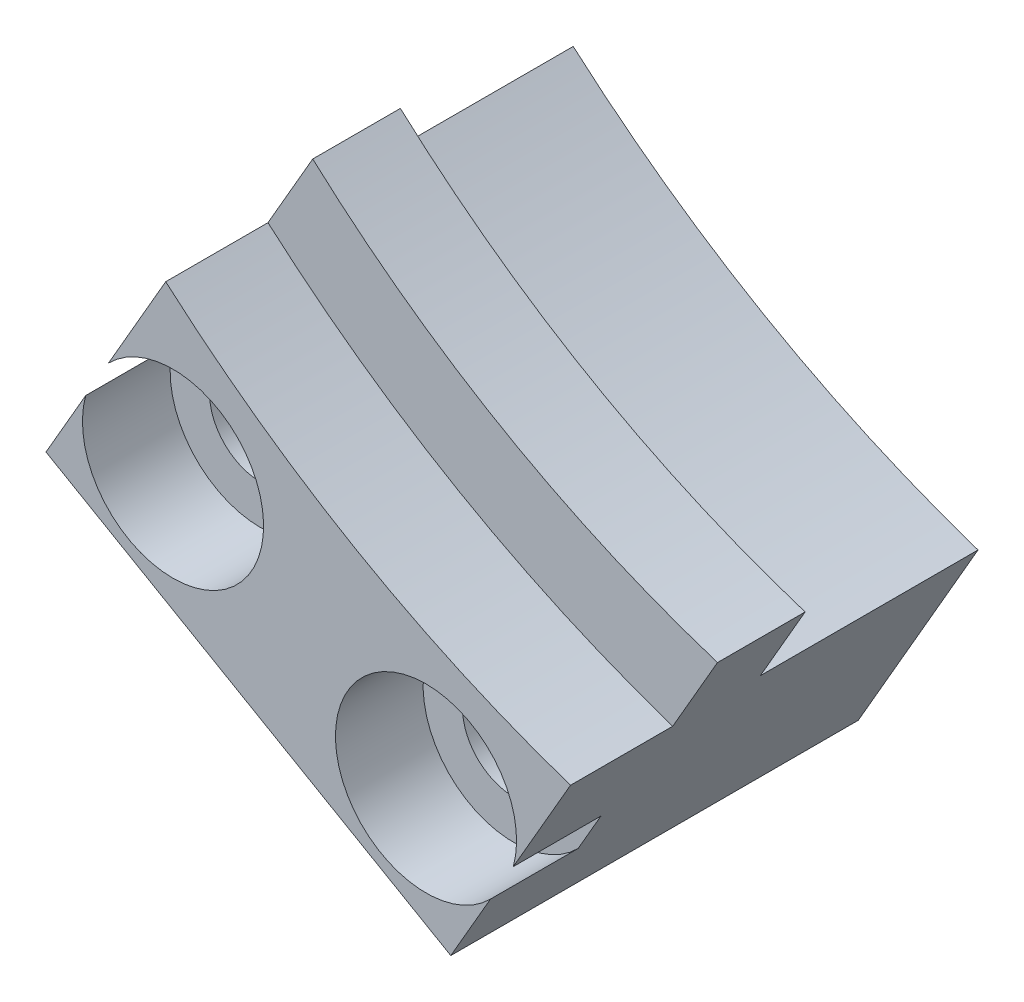
ISO-10303-21;
HEADER;
FILE_DESCRIPTION(('STEP AP214'),'2;1');
FILE_NAME('part.step','',(''),(''),'','','');
FILE_SCHEMA(('AUTOMOTIVE_DESIGN { 1 0 10303 214 1 1 1 1 }'));
ENDSEC;
DATA;
#1=APPLICATION_CONTEXT('core data for automotive mechanical design processes');
#2=APPLICATION_PROTOCOL_DEFINITION('international standard','automotive_design',2000,#1);
#3=PRODUCT_CONTEXT('',#1,'mechanical');
#4=PRODUCT('Part','Part','',(#3));
#5=PRODUCT_RELATED_PRODUCT_CATEGORY('part','',(#4));
#6=PRODUCT_DEFINITION_FORMATION('','',#4);
#7=PRODUCT_DEFINITION_CONTEXT('part definition',#1,'design');
#8=PRODUCT_DEFINITION('design','',#6,#7);
#9=PRODUCT_DEFINITION_SHAPE('','',#8);
#10=(LENGTH_UNIT() NAMED_UNIT(*) SI_UNIT(.MILLI.,.METRE.));
#11=(NAMED_UNIT(*) PLANE_ANGLE_UNIT() SI_UNIT($,.RADIAN.));
#12=(NAMED_UNIT(*) SI_UNIT($,.STERADIAN.) SOLID_ANGLE_UNIT());
#13=UNCERTAINTY_MEASURE_WITH_UNIT(LENGTH_MEASURE(1.E-05),#10,'distance_accuracy_value','');
#14=(GEOMETRIC_REPRESENTATION_CONTEXT(3) GLOBAL_UNCERTAINTY_ASSIGNED_CONTEXT((#13)) GLOBAL_UNIT_ASSIGNED_CONTEXT((#10,
#11,#12)) REPRESENTATION_CONTEXT('',''));
#15=CARTESIAN_POINT('',(0.,0.,0.));
#16=DIRECTION('',(0.,0.,1.));
#17=DIRECTION('',(1.,0.,0.));
#18=AXIS2_PLACEMENT_3D('',#15,#16,#17);
#19=CARTESIAN_POINT('',(-17.91987298107,-41.0381304684,57.));
#20=DIRECTION('',(0.,0.,1.));
#21=DIRECTION('',(1.,0.,0.));
#22=AXIS2_PLACEMENT_3D('',#19,#20,#21);
#23=PLANE('',#22);
#24=CARTESIAN_POINT('',(-17.91987298107,-41.0381304684,57.));
#25=DIRECTION('',(0.,0.,1.));
#26=DIRECTION('',(-0.50000000000019,-0.866025403784329,0.));
#27=AXIS2_PLACEMENT_3D('',#24,#25,#26);
#28=CIRCLE('',#27,1.75);
#29=CARTESIAN_POINT('',(-18.79487298107,-42.55367492503,57.));
#30=VERTEX_POINT('',#29);
#31=EDGE_CURVE('E24',#30,#30,#28,.T.);
#32=ORIENTED_EDGE('',*,*,#31,.F.);
#33=EDGE_LOOP('',(#32));
#34=FACE_BOUND('',#33,.T.);
#35=DIRECTION('',(-0.50000000000019,-0.866025403784329,0.));
#36=VECTOR('',#35,1.);
#37=CARTESIAN_POINT('',(-13.69679676972,-39.7235479061,57.));
#38=LINE('',#37,#36);
#39=CARTESIAN_POINT('',(-14.93128428592,-41.86174300548,57.));
#40=VERTEX_POINT('',#39);
#41=CARTESIAN_POINT('',(-15.71230925352,-43.21451793133,57.));
#42=VERTEX_POINT('',#41);
#43=EDGE_CURVE('E190',#40,#42,#38,.T.);
#44=ORIENTED_EDGE('',*,*,#43,.F.);
#45=CARTESIAN_POINT('',(-17.91987298107,-41.0381304684,57.));
#46=DIRECTION('',(0.,0.,-1.));
#47=DIRECTION('',(0.712117331470054,-0.702060471911053,0.));
#48=AXIS2_PLACEMENT_3D('',#45,#46,#47);
#49=CIRCLE('',#48,3.1);
#50=EDGE_CURVE('E10',#42,#40,#49,.T.);
#51=ORIENTED_EDGE('',*,*,#50,.F.);
#52=EDGE_LOOP('',(#44,#51));
#53=FACE_BOUND('',#52,.T.);
#54=ADVANCED_FACE('F16',(#34,#53),#23,.T.);
#55=CARTESIAN_POINT('',(-17.91987298107,-41.0381304684,57.));
#56=DIRECTION('',(0.,0.,1.));
#57=DIRECTION('',(-0.50000000000019,-0.866025403784329,0.));
#58=AXIS2_PLACEMENT_3D('',#55,#56,#57);
#59=CYLINDRICAL_SURFACE('',#58,3.1);
#60=DIRECTION('',(0.,0.,1.));
#61=VECTOR('',#60,1.);
#62=CARTESIAN_POINT('',(-14.93128428592,-41.86174300548,57.));
#63=LINE('',#62,#61);
#64=CARTESIAN_POINT('',(-14.93128428592,-41.86174300548,60.));
#65=VERTEX_POINT('',#64);
#66=EDGE_CURVE('E187',#40,#65,#63,.T.);
#67=ORIENTED_EDGE('',*,*,#66,.T.);
#68=CARTESIAN_POINT('',(-17.91987298107,-41.0381304684,60.));
#69=DIRECTION('',(0.,0.,-1.));
#70=DIRECTION('',(0.712117331470054,-0.702060471911053,0.));
#71=AXIS2_PLACEMENT_3D('',#68,#69,#70);
#72=CIRCLE('',#71,3.1);
#73=CARTESIAN_POINT('',(-15.71230925352,-43.21451793133,60.));
#74=VERTEX_POINT('',#73);
#75=EDGE_CURVE('E224',#74,#65,#72,.T.);
#76=ORIENTED_EDGE('',*,*,#75,.F.);
#77=DIRECTION('',(0.,0.,1.));
#78=VECTOR('',#77,1.);
#79=CARTESIAN_POINT('',(-15.71230925352,-43.21451793133,57.));
#80=LINE('',#79,#78);
#81=EDGE_CURVE('E296',#42,#74,#80,.T.);
#82=ORIENTED_EDGE('',*,*,#81,.F.);
#83=ORIENTED_EDGE('',*,*,#50,.T.);
#84=EDGE_LOOP('',(#67,#76,#82,#83));
#85=FACE_BOUND('',#84,.T.);
#86=ADVANCED_FACE('F371',(#85),#59,.F.);
#87=CARTESIAN_POINT('',(-17.91987298107,-41.0381304684,46.));
#88=DIRECTION('',(0.,0.,1.));
#89=DIRECTION('',(-0.50000000000019,-0.866025403784329,0.));
#90=AXIS2_PLACEMENT_3D('',#87,#88,#89);
#91=CYLINDRICAL_SURFACE('',#90,1.75);
#92=DIRECTION('',(0.,0.,1.));
#93=VECTOR('',#92,1.);
#94=CARTESIAN_POINT('',(-18.79487298107,-42.55367492503,46.));
#95=LINE('',#94,#93);
#96=CARTESIAN_POINT('',(-18.79487298107,-42.55367492503,46.05));
#97=VERTEX_POINT('',#96);
#98=EDGE_CURVE('E302',#97,#30,#95,.T.);
#99=ORIENTED_EDGE('',*,*,#98,.F.);
#100=CARTESIAN_POINT('',(-17.91987298107,-41.0381304684,46.05));
#101=DIRECTION('',(0.,0.,1.));
#102=DIRECTION('',(-0.50000000000019,-0.866025403784329,0.));
#103=AXIS2_PLACEMENT_3D('',#100,#101,#102);
#104=CIRCLE('',#103,1.75);
#105=EDGE_CURVE('E233',#97,#97,#104,.T.);
#106=ORIENTED_EDGE('',*,*,#105,.F.);
#107=ORIENTED_EDGE('',*,*,#98,.T.);
#108=ORIENTED_EDGE('',*,*,#31,.T.);
#109=EDGE_LOOP('',(#99,#106,#107,#108));
#110=FACE_BOUND('',#109,.T.);
#111=ADVANCED_FACE('F366',(#110),#91,.F.);
#112=CARTESIAN_POINT('',(-26.58012701892,-36.0381304684,46.));
#113=DIRECTION('',(0.,0.,1.));
#114=DIRECTION('',(-0.50000000000019,-0.866025403784329,0.));
#115=AXIS2_PLACEMENT_3D('',#112,#113,#114);
#116=CYLINDRICAL_SURFACE('',#115,1.75);
#117=DIRECTION('',(0.,0.,1.));
#118=VECTOR('',#117,1.);
#119=CARTESIAN_POINT('',(-27.45512701892,-37.55367492503,46.));
#120=LINE('',#119,#118);
#121=CARTESIAN_POINT('',(-27.45512701892,-37.55367492503,46.05));
#122=VERTEX_POINT('',#121);
#123=CARTESIAN_POINT('',(-27.45512701892,-37.55367492503,57.));
#124=VERTEX_POINT('',#123);
#125=EDGE_CURVE('E299',#122,#124,#120,.T.);
#126=ORIENTED_EDGE('',*,*,#125,.F.);
#127=CARTESIAN_POINT('',(-26.58012701892,-36.0381304684,46.05));
#128=DIRECTION('',(0.,0.,1.));
#129=DIRECTION('',(-0.50000000000019,-0.866025403784329,0.));
#130=AXIS2_PLACEMENT_3D('',#127,#128,#129);
#131=CIRCLE('',#130,1.75);
#132=EDGE_CURVE('E194',#122,#122,#131,.T.);
#133=ORIENTED_EDGE('',*,*,#132,.F.);
#134=ORIENTED_EDGE('',*,*,#125,.T.);
#135=CARTESIAN_POINT('',(-26.58012701892,-36.0381304684,57.));
#136=DIRECTION('',(0.,0.,1.));
#137=DIRECTION('',(-0.50000000000019,-0.866025403784329,0.));
#138=AXIS2_PLACEMENT_3D('',#135,#136,#137);
#139=CIRCLE('',#138,1.75);
#140=EDGE_CURVE('E223',#124,#124,#139,.T.);
#141=ORIENTED_EDGE('',*,*,#140,.T.);
#142=EDGE_LOOP('',(#126,#133,#134,#141));
#143=FACE_BOUND('',#142,.T.);
#144=ADVANCED_FACE('F370',(#143),#116,.F.);
#145=CARTESIAN_POINT('',(-12.07179676972,-36.9089653438,46.05));
#146=DIRECTION('',(0.866025403784329,-0.50000000000019,0.));
#147=DIRECTION('',(0.,0.,-1.));
#148=AXIS2_PLACEMENT_3D('',#145,#146,#147);
#149=PLANE('',#148);
#150=DIRECTION('',(-0.50000000000019,-0.866025403784329,0.));
#151=VECTOR('',#150,1.);
#152=CARTESIAN_POINT('',(-12.07179676972,-36.9089653438,46.05));
#153=LINE('',#152,#151);
#154=CARTESIAN_POINT('',(-12.97380671847,-38.47129240397,46.05));
#155=VERTEX_POINT('',#154);
#156=CARTESIAN_POINT('',(-17.07179676972,-45.56921938165,46.05));
#157=VERTEX_POINT('',#156);
#158=EDGE_CURVE('E156',#155,#157,#153,.T.);
#159=ORIENTED_EDGE('',*,*,#158,.F.);
#160=DIRECTION('',(0.,0.,1.));
#161=VECTOR('',#160,1.);
#162=CARTESIAN_POINT('',(-12.97380671847,-38.47129240397,46.));
#163=LINE('',#162,#161);
#164=CARTESIAN_POINT('',(-12.97380671847,-38.47129240397,53.5));
#165=VERTEX_POINT('',#164);
#166=EDGE_CURVE('E191',#155,#165,#163,.T.);
#167=ORIENTED_EDGE('',*,*,#166,.T.);
#168=DIRECTION('',(-0.50000000000019,-0.866025403784329,0.));
#169=VECTOR('',#168,1.);
#170=CARTESIAN_POINT('',(-8.071796769725,-29.98076211353,53.5));
#171=LINE('',#170,#169);
#172=CARTESIAN_POINT('',(-11.44133677485,-35.81697660055,53.5));
#173=VERTEX_POINT('',#172);
#174=EDGE_CURVE('E283',#173,#165,#171,.T.);
#175=ORIENTED_EDGE('',*,*,#174,.F.);
#176=DIRECTION('',(0.,0.,1.));
#177=VECTOR('',#176,1.);
#178=CARTESIAN_POINT('',(-11.44133677485,-35.81697660055,52.5));
#179=LINE('',#178,#177);
#180=CARTESIAN_POINT('',(-11.44133677485,-35.81697660055,56.5));
#181=VERTEX_POINT('',#180);
#182=EDGE_CURVE('E276',#173,#181,#179,.T.);
#183=ORIENTED_EDGE('',*,*,#182,.T.);
#184=DIRECTION('',(-0.50000000000019,-0.866025403784329,0.));
#185=VECTOR('',#184,1.);
#186=CARTESIAN_POINT('',(-8.071796769725,-29.98076211353,56.5));
#187=LINE('',#186,#185);
#188=CARTESIAN_POINT('',(-12.97380671847,-38.47129240397,56.5));
#189=VERTEX_POINT('',#188);
#190=EDGE_CURVE('E268',#181,#189,#187,.T.);
#191=ORIENTED_EDGE('',*,*,#190,.T.);
#192=DIRECTION('',(0.,0.,1.));
#193=VECTOR('',#192,1.);
#194=CARTESIAN_POINT('',(-12.97380671847,-38.47129240397,46.));
#195=LINE('',#194,#193);
#196=CARTESIAN_POINT('',(-12.97380671847,-38.47129240397,60.));
#197=VERTEX_POINT('',#196);
#198=EDGE_CURVE('E263',#189,#197,#195,.T.);
#199=ORIENTED_EDGE('',*,*,#198,.T.);
#200=DIRECTION('',(-0.50000000000019,-0.866025403784329,0.));
#201=VECTOR('',#200,1.);
#202=CARTESIAN_POINT('',(-12.07179676972,-36.9089653438,60.));
#203=LINE('',#202,#201);
#204=EDGE_CURVE('E244',#197,#65,#203,.T.);
#205=ORIENTED_EDGE('',*,*,#204,.T.);
#206=ORIENTED_EDGE('',*,*,#66,.F.);
#207=ORIENTED_EDGE('',*,*,#43,.T.);
#208=ORIENTED_EDGE('',*,*,#81,.T.);
#209=DIRECTION('',(-0.50000000000019,-0.866025403784329,0.));
#210=VECTOR('',#209,1.);
#211=CARTESIAN_POINT('',(-12.07179676972,-36.9089653438,60.));
#212=LINE('',#211,#210);
#213=CARTESIAN_POINT('',(-17.07179676972,-45.56921938165,60.));
#214=VERTEX_POINT('',#213);
#215=EDGE_CURVE('E254',#74,#214,#212,.T.);
#216=ORIENTED_EDGE('',*,*,#215,.T.);
#217=DIRECTION('',(0.,0.,1.));
#218=VECTOR('',#217,1.);
#219=CARTESIAN_POINT('',(-17.07179676972,-45.56921938165,46.05));
#220=LINE('',#219,#218);
#221=EDGE_CURVE('E239',#157,#214,#220,.T.);
#222=ORIENTED_EDGE('',*,*,#221,.F.);
#223=EDGE_LOOP('',(#159,#167,#175,#183,#191,#199,#205,#206,#207,#208,#216,#222));
#224=FACE_BOUND('',#223,.T.);
#225=ADVANCED_FACE('F353',(#224),#149,.T.);
#226=CARTESIAN_POINT('',(0.,0.,46.));
#227=DIRECTION('',(0.,0.,1.));
#228=DIRECTION('',(-0.50000000000019,-0.866025403784329,0.));
#229=AXIS2_PLACEMENT_3D('',#226,#227,#228);
#230=CYLINDRICAL_SURFACE('',#229,40.6);
#231=CARTESIAN_POINT('',(0.,0.,53.5));
#232=DIRECTION('',(0.,0.,1.));
#233=DIRECTION('',(-0.50000000000019,-0.866025403784329,0.));
#234=AXIS2_PLACEMENT_3D('',#231,#232,#233);
#235=CIRCLE('',#234,40.6);
#236=CARTESIAN_POINT('',(-26.83021317902,-30.47129240397,53.5));
#237=VERTEX_POINT('',#236);
#238=EDGE_CURVE('E287',#237,#165,#235,.T.);
#239=ORIENTED_EDGE('',*,*,#238,.T.);
#240=ORIENTED_EDGE('',*,*,#166,.F.);
#241=CARTESIAN_POINT('',(0.,0.,46.05));
#242=DIRECTION('',(0.,0.,1.));
#243=DIRECTION('',(-0.660842689137976,-0.750524443447972,0.));
#244=AXIS2_PLACEMENT_3D('',#241,#242,#243);
#245=CIRCLE('',#244,40.6);
#246=CARTESIAN_POINT('',(-26.83021317902,-30.47129240397,46.05));
#247=VERTEX_POINT('',#246);
#248=EDGE_CURVE('E161',#247,#155,#245,.T.);
#249=ORIENTED_EDGE('',*,*,#248,.F.);
#250=DIRECTION('',(0.,0.,1.));
#251=VECTOR('',#250,1.);
#252=CARTESIAN_POINT('',(-26.83021317902,-30.47129240397,46.));
#253=LINE('',#252,#251);
#254=EDGE_CURVE('E170',#247,#237,#253,.T.);
#255=ORIENTED_EDGE('',*,*,#254,.T.);
#256=EDGE_LOOP('',(#239,#240,#249,#255));
#257=FACE_BOUND('',#256,.T.);
#258=ADVANCED_FACE('F348',(#257),#230,.F.);
#259=CARTESIAN_POINT('',(0.,0.,53.5));
#260=DIRECTION('',(0.,0.,1.));
#261=DIRECTION('',(1.,0.,0.));
#262=AXIS2_PLACEMENT_3D('',#259,#260,#261);
#263=PLANE('',#262);
#264=CARTESIAN_POINT('',(0.,0.,53.5));
#265=DIRECTION('',(0.,0.,1.));
#266=DIRECTION('',(-0.672812320091011,-0.739813207461012,0.));
#267=AXIS2_PLACEMENT_3D('',#264,#265,#266);
#268=CIRCLE('',#267,37.6);
#269=CARTESIAN_POINT('',(-25.2977432354,-27.81697660055,53.5));
#270=VERTEX_POINT('',#269);
#271=EDGE_CURVE('E279',#270,#173,#268,.T.);
#272=ORIENTED_EDGE('',*,*,#271,.T.);
#273=ORIENTED_EDGE('',*,*,#174,.T.);
#274=ORIENTED_EDGE('',*,*,#238,.F.);
#275=DIRECTION('',(-0.50000000000019,-0.866025403784329,0.));
#276=VECTOR('',#275,1.);
#277=CARTESIAN_POINT('',(-21.92820323027,-21.98076211353,53.5));
#278=LINE('',#277,#276);
#279=EDGE_CURVE('E219',#270,#237,#278,.T.);
#280=ORIENTED_EDGE('',*,*,#279,.F.);
#281=EDGE_LOOP('',(#272,#273,#274,#280));
#282=FACE_BOUND('',#281,.T.);
#283=ADVANCED_FACE('F352',(#282),#263,.F.);
#284=CARTESIAN_POINT('',(0.,0.,52.5));
#285=DIRECTION('',(0.,0.,1.));
#286=DIRECTION('',(-0.50000000000019,-0.866025403784329,0.));
#287=AXIS2_PLACEMENT_3D('',#284,#285,#286);
#288=CYLINDRICAL_SURFACE('',#287,37.6);
#289=DIRECTION('',(0.,0.,1.));
#290=VECTOR('',#289,1.);
#291=CARTESIAN_POINT('',(-25.2977432354,-27.81697660055,52.5));
#292=LINE('',#291,#290);
#293=CARTESIAN_POINT('',(-25.2977432354,-27.81697660055,56.5));
#294=VERTEX_POINT('',#293);
#295=EDGE_CURVE('E215',#270,#294,#292,.T.);
#296=ORIENTED_EDGE('',*,*,#295,.T.);
#297=CARTESIAN_POINT('',(0.,0.,56.5));
#298=DIRECTION('',(0.,0.,-1.));
#299=DIRECTION('',(-0.304290871672041,-0.95257916490813,0.));
#300=AXIS2_PLACEMENT_3D('',#297,#298,#299);
#301=CIRCLE('',#300,37.6);
#302=EDGE_CURVE('E273',#181,#294,#301,.T.);
#303=ORIENTED_EDGE('',*,*,#302,.F.);
#304=ORIENTED_EDGE('',*,*,#182,.F.);
#305=ORIENTED_EDGE('',*,*,#271,.F.);
#306=EDGE_LOOP('',(#296,#303,#304,#305));
#307=FACE_BOUND('',#306,.T.);
#308=ADVANCED_FACE('F412',(#307),#288,.F.);
#309=CARTESIAN_POINT('',(0.,0.,56.5));
#310=DIRECTION('',(0.,0.,1.));
#311=DIRECTION('',(1.,0.,0.));
#312=AXIS2_PLACEMENT_3D('',#309,#310,#311);
#313=PLANE('',#312);
#314=DIRECTION('',(-0.50000000000019,-0.866025403784329,0.));
#315=VECTOR('',#314,1.);
#316=CARTESIAN_POINT('',(-21.92820323027,-21.98076211353,56.5));
#317=LINE('',#316,#315);
#318=CARTESIAN_POINT('',(-26.83021317902,-30.47129240397,56.5));
#319=VERTEX_POINT('',#318);
#320=EDGE_CURVE('E211',#294,#319,#317,.T.);
#321=ORIENTED_EDGE('',*,*,#320,.T.);
#322=CARTESIAN_POINT('',(0.,0.,56.5));
#323=DIRECTION('',(0.,0.,1.));
#324=DIRECTION('',(-0.50000000000019,-0.866025403784329,0.));
#325=AXIS2_PLACEMENT_3D('',#322,#323,#324);
#326=CIRCLE('',#325,40.6);
#327=EDGE_CURVE('E264',#319,#189,#326,.T.);
#328=ORIENTED_EDGE('',*,*,#327,.T.);
#329=ORIENTED_EDGE('',*,*,#190,.F.);
#330=ORIENTED_EDGE('',*,*,#302,.T.);
#331=EDGE_LOOP('',(#321,#328,#329,#330));
#332=FACE_BOUND('',#331,.T.);
#333=ADVANCED_FACE('F403',(#332),#313,.T.);
#334=CARTESIAN_POINT('',(0.,0.,46.));
#335=DIRECTION('',(0.,0.,1.));
#336=DIRECTION('',(-0.50000000000019,-0.866025403784329,0.));
#337=AXIS2_PLACEMENT_3D('',#334,#335,#336);
#338=CYLINDRICAL_SURFACE('',#337,40.6);
#339=CARTESIAN_POINT('',(0.,0.,60.));
#340=DIRECTION('',(0.,0.,-1.));
#341=DIRECTION('',(-0.319551889617921,-0.947568778422768,0.));
#342=AXIS2_PLACEMENT_3D('',#339,#340,#341);
#343=CIRCLE('',#342,40.6);
#344=CARTESIAN_POINT('',(-26.83021317902,-30.47129240397,60.));
#345=VERTEX_POINT('',#344);
#346=EDGE_CURVE('E248',#197,#345,#343,.T.);
#347=ORIENTED_EDGE('',*,*,#346,.F.);
#348=ORIENTED_EDGE('',*,*,#198,.F.);
#349=ORIENTED_EDGE('',*,*,#327,.F.);
#350=DIRECTION('',(0.,0.,1.));
#351=VECTOR('',#350,1.);
#352=CARTESIAN_POINT('',(-26.83021317902,-30.47129240397,46.));
#353=LINE('',#352,#351);
#354=EDGE_CURVE('E199',#319,#345,#353,.T.);
#355=ORIENTED_EDGE('',*,*,#354,.T.);
#356=EDGE_LOOP('',(#347,#348,#349,#355));
#357=FACE_BOUND('',#356,.T.);
#358=ADVANCED_FACE('F317',(#357),#338,.F.);
#359=CARTESIAN_POINT('',(-26.58012701892,-36.0381304684,57.));
#360=DIRECTION('',(0.,0.,1.));
#361=DIRECTION('',(1.,0.,0.));
#362=AXIS2_PLACEMENT_3D('',#359,#360,#361);
#363=PLANE('',#362);
#364=ORIENTED_EDGE('',*,*,#140,.F.);
#365=EDGE_LOOP('',(#364));
#366=FACE_BOUND('',#365,.T.);
#367=DIRECTION('',(-0.50000000000019,-0.866025403784329,0.));
#368=VECTOR('',#367,1.);
#369=CARTESIAN_POINT('',(-27.55320323027,-31.7235479061,57.));
#370=LINE('',#369,#368);
#371=CARTESIAN_POINT('',(-28.78769074648,-33.86174300548,57.));
#372=VERTEX_POINT('',#371);
#373=CARTESIAN_POINT('',(-29.56871571407,-35.21451793133,57.));
#374=VERTEX_POINT('',#373);
#375=EDGE_CURVE('E204',#372,#374,#370,.T.);
#376=ORIENTED_EDGE('',*,*,#375,.T.);
#377=CARTESIAN_POINT('',(-26.58012701892,-36.0381304684,57.));
#378=DIRECTION('',(0.,0.,-1.));
#379=DIRECTION('',(-0.712117331470054,0.702060471911053,0.));
#380=AXIS2_PLACEMENT_3D('',#377,#378,#379);
#381=CIRCLE('',#380,3.1);
#382=EDGE_CURVE('E220',#372,#374,#381,.T.);
#383=ORIENTED_EDGE('',*,*,#382,.F.);
#384=EDGE_LOOP('',(#376,#383));
#385=FACE_BOUND('',#384,.T.);
#386=ADVANCED_FACE('F311',(#366,#385),#363,.T.);
#387=CARTESIAN_POINT('',(-26.58012701892,-36.0381304684,57.));
#388=DIRECTION('',(0.,0.,1.));
#389=DIRECTION('',(-0.50000000000019,-0.866025403784329,0.));
#390=AXIS2_PLACEMENT_3D('',#387,#388,#389);
#391=CYLINDRICAL_SURFACE('',#390,3.1);
#392=DIRECTION('',(0.,0.,1.));
#393=VECTOR('',#392,1.);
#394=CARTESIAN_POINT('',(-29.56871571407,-35.21451793133,57.));
#395=LINE('',#394,#393);
#396=CARTESIAN_POINT('',(-29.56871571407,-35.21451793133,60.));
#397=VERTEX_POINT('',#396);
#398=EDGE_CURVE('E183',#374,#397,#395,.T.);
#399=ORIENTED_EDGE('',*,*,#398,.T.);
#400=CARTESIAN_POINT('',(-26.58012701892,-36.0381304684,60.));
#401=DIRECTION('',(0.,0.,-1.));
#402=DIRECTION('',(-0.712117331470054,0.702060471911053,0.));
#403=AXIS2_PLACEMENT_3D('',#400,#401,#402);
#404=CIRCLE('',#403,3.1);
#405=CARTESIAN_POINT('',(-28.78769074648,-33.86174300548,60.));
#406=VERTEX_POINT('',#405);
#407=EDGE_CURVE('E251',#406,#397,#404,.T.);
#408=ORIENTED_EDGE('',*,*,#407,.F.);
#409=DIRECTION('',(0.,0.,1.));
#410=VECTOR('',#409,1.);
#411=CARTESIAN_POINT('',(-28.78769074648,-33.86174300548,57.));
#412=LINE('',#411,#410);
#413=EDGE_CURVE('E200',#372,#406,#412,.T.);
#414=ORIENTED_EDGE('',*,*,#413,.F.);
#415=ORIENTED_EDGE('',*,*,#382,.T.);
#416=EDGE_LOOP('',(#399,#408,#414,#415));
#417=FACE_BOUND('',#416,.T.);
#418=ADVANCED_FACE('F316',(#417),#391,.F.);
#419=CARTESIAN_POINT('',(-25.92820323027,-28.9089653438,60.));
#420=DIRECTION('',(0.,0.,1.));
#421=DIRECTION('',(1.,0.,0.));
#422=AXIS2_PLACEMENT_3D('',#419,#420,#421);
#423=PLANE('',#422);
#424=ORIENTED_EDGE('',*,*,#204,.F.);
#425=ORIENTED_EDGE('',*,*,#346,.T.);
#426=DIRECTION('',(-0.50000000000019,-0.866025403784329,0.));
#427=VECTOR('',#426,1.);
#428=CARTESIAN_POINT('',(-25.92820323027,-28.9089653438,60.));
#429=LINE('',#428,#427);
#430=EDGE_CURVE('E195',#345,#406,#429,.T.);
#431=ORIENTED_EDGE('',*,*,#430,.T.);
#432=ORIENTED_EDGE('',*,*,#407,.T.);
#433=DIRECTION('',(-0.50000000000019,-0.866025403784329,0.));
#434=VECTOR('',#433,1.);
#435=CARTESIAN_POINT('',(-25.92820323027,-28.9089653438,60.));
#436=LINE('',#435,#434);
#437=CARTESIAN_POINT('',(-30.92820323027,-37.56921938165,60.));
#438=VERTEX_POINT('',#437);
#439=EDGE_CURVE('E178',#397,#438,#436,.T.);
#440=ORIENTED_EDGE('',*,*,#439,.T.);
#441=DIRECTION('',(0.866025403784329,-0.50000000000019,0.));
#442=VECTOR('',#441,1.);
#443=CARTESIAN_POINT('',(-30.92820323027,-37.56921938165,60.));
#444=LINE('',#443,#442);
#445=EDGE_CURVE('E175',#438,#214,#444,.T.);
#446=ORIENTED_EDGE('',*,*,#445,.T.);
#447=ORIENTED_EDGE('',*,*,#215,.F.);
#448=ORIENTED_EDGE('',*,*,#75,.T.);
#449=EDGE_LOOP('',(#424,#425,#431,#432,#440,#446,#447,#448));
#450=FACE_BOUND('',#449,.T.);
#451=ADVANCED_FACE('F334',(#450),#423,.T.);
#452=CARTESIAN_POINT('',(-30.92820323027,-37.56921938165,46.05));
#453=DIRECTION('',(-0.50000000000019,-0.866025403784329,0.));
#454=DIRECTION('',(-0.866025403784329,0.50000000000019,0.));
#455=AXIS2_PLACEMENT_3D('',#452,#453,#454);
#456=PLANE('',#455);
#457=DIRECTION('',(0.,0.,1.));
#458=VECTOR('',#457,1.);
#459=CARTESIAN_POINT('',(-30.92820323027,-37.56921938165,46.05));
#460=LINE('',#459,#458);
#461=CARTESIAN_POINT('',(-30.92820323027,-37.56921938165,46.05));
#462=VERTEX_POINT('',#461);
#463=EDGE_CURVE('E167',#462,#438,#460,.T.);
#464=ORIENTED_EDGE('',*,*,#463,.F.);
#465=DIRECTION('',(0.866025403784329,-0.50000000000019,0.));
#466=VECTOR('',#465,1.);
#467=CARTESIAN_POINT('',(-30.92820323027,-37.56921938165,46.05));
#468=LINE('',#467,#466);
#469=EDGE_CURVE('E149',#462,#157,#468,.T.);
#470=ORIENTED_EDGE('',*,*,#469,.T.);
#471=ORIENTED_EDGE('',*,*,#221,.T.);
#472=ORIENTED_EDGE('',*,*,#445,.F.);
#473=EDGE_LOOP('',(#464,#470,#471,#472));
#474=FACE_BOUND('',#473,.T.);
#475=ADVANCED_FACE('F173',(#474),#456,.T.);
#476=CARTESIAN_POINT('',(-25.92820323027,-28.9089653438,46.05));
#477=DIRECTION('',(0.,0.,1.));
#478=DIRECTION('',(1.,0.,0.));
#479=AXIS2_PLACEMENT_3D('',#476,#477,#478);
#480=PLANE('',#479);
#481=ORIENTED_EDGE('',*,*,#105,.T.);
#482=EDGE_LOOP('',(#481));
#483=FACE_BOUND('',#482,.T.);
#484=ORIENTED_EDGE('',*,*,#132,.T.);
#485=EDGE_LOOP('',(#484));
#486=FACE_BOUND('',#485,.T.);
#487=ORIENTED_EDGE('',*,*,#469,.F.);
#488=DIRECTION('',(-0.50000000000019,-0.866025403784329,0.));
#489=VECTOR('',#488,1.);
#490=CARTESIAN_POINT('',(-25.92820323027,-28.9089653438,46.05));
#491=LINE('',#490,#489);
#492=EDGE_CURVE('E153',#247,#462,#491,.T.);
#493=ORIENTED_EDGE('',*,*,#492,.F.);
#494=ORIENTED_EDGE('',*,*,#248,.T.);
#495=ORIENTED_EDGE('',*,*,#158,.T.);
#496=EDGE_LOOP('',(#487,#493,#494,#495));
#497=FACE_BOUND('',#496,.T.);
#498=ADVANCED_FACE('F151',(#483,#486,#497),#480,.F.);
#499=CARTESIAN_POINT('',(-25.92820323027,-28.9089653438,46.05));
#500=DIRECTION('',(0.866025403784329,-0.50000000000019,0.));
#501=DIRECTION('',(0.,0.,-1.));
#502=AXIS2_PLACEMENT_3D('',#499,#500,#501);
#503=PLANE('',#502);
#504=ORIENTED_EDGE('',*,*,#463,.T.);
#505=ORIENTED_EDGE('',*,*,#439,.F.);
#506=ORIENTED_EDGE('',*,*,#398,.F.);
#507=ORIENTED_EDGE('',*,*,#375,.F.);
#508=ORIENTED_EDGE('',*,*,#413,.T.);
#509=ORIENTED_EDGE('',*,*,#430,.F.);
#510=ORIENTED_EDGE('',*,*,#354,.F.);
#511=ORIENTED_EDGE('',*,*,#320,.F.);
#512=ORIENTED_EDGE('',*,*,#295,.F.);
#513=ORIENTED_EDGE('',*,*,#279,.T.);
#514=ORIENTED_EDGE('',*,*,#254,.F.);
#515=ORIENTED_EDGE('',*,*,#492,.T.);
#516=EDGE_LOOP('',(#504,#505,#506,#507,#508,#509,#510,#511,#512,#513,#514,#515));
#517=FACE_BOUND('',#516,.T.);
#518=ADVANCED_FACE('F165',(#517),#503,.F.);
#519=CLOSED_SHELL('',(#54,#86,#111,#144,#225,#258,#283,#308,#333,#358,#386,#418,#451,#475,#498,#518));
#520=MANIFOLD_SOLID_BREP('B1',#519);
#521=ADVANCED_BREP_SHAPE_REPRESENTATION('',(#18,#520),#14);
#522=SHAPE_DEFINITION_REPRESENTATION(#9,#521);
ENDSEC;
END-ISO-10303-21;
